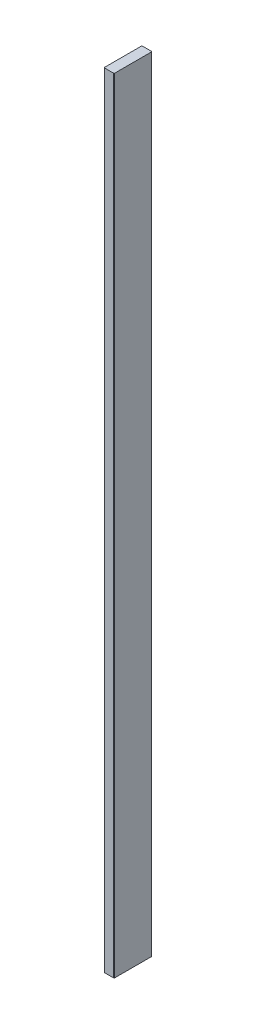
ISO-10303-21;
HEADER;
FILE_DESCRIPTION(('STEP AP214'),'2;1');
FILE_NAME('part.step','',(''),(''),'','','');
FILE_SCHEMA(('AUTOMOTIVE_DESIGN { 1 0 10303 214 1 1 1 1 }'));
ENDSEC;
DATA;
#1=APPLICATION_CONTEXT('core data for automotive mechanical design processes');
#2=APPLICATION_PROTOCOL_DEFINITION('international standard','automotive_design',2000,#1);
#3=PRODUCT_CONTEXT('',#1,'mechanical');
#4=PRODUCT('Part','Part','',(#3));
#5=PRODUCT_RELATED_PRODUCT_CATEGORY('part','',(#4));
#6=PRODUCT_DEFINITION_FORMATION('','',#4);
#7=PRODUCT_DEFINITION_CONTEXT('part definition',#1,'design');
#8=PRODUCT_DEFINITION('design','',#6,#7);
#9=PRODUCT_DEFINITION_SHAPE('','',#8);
#10=(LENGTH_UNIT() NAMED_UNIT(*) SI_UNIT(.MILLI.,.METRE.));
#11=(NAMED_UNIT(*) PLANE_ANGLE_UNIT() SI_UNIT($,.RADIAN.));
#12=(NAMED_UNIT(*) SI_UNIT($,.STERADIAN.) SOLID_ANGLE_UNIT());
#13=UNCERTAINTY_MEASURE_WITH_UNIT(LENGTH_MEASURE(1.E-05),#10,'distance_accuracy_value','');
#14=(GEOMETRIC_REPRESENTATION_CONTEXT(3) GLOBAL_UNCERTAINTY_ASSIGNED_CONTEXT((#13)) GLOBAL_UNIT_ASSIGNED_CONTEXT((#10,
#11,#12)) REPRESENTATION_CONTEXT('',''));
#15=CARTESIAN_POINT('',(0.,0.,0.));
#16=DIRECTION('',(0.,0.,1.));
#17=DIRECTION('',(1.,0.,0.));
#18=AXIS2_PLACEMENT_3D('',#15,#16,#17);
#19=CARTESIAN_POINT('',(16.,2482.,60.));
#20=DIRECTION('',(-1.,0.,0.));
#21=DIRECTION('',(0.,0.,1.));
#22=AXIS2_PLACEMENT_3D('',#19,#20,#21);
#23=PLANE('',#22);
#24=DIRECTION('',(0.,0.,-1.));
#25=VECTOR('',#24,1.);
#26=CARTESIAN_POINT('',(16.,0.,60.));
#27=LINE('',#26,#25);
#28=CARTESIAN_POINT('',(16.,0.,58.));
#29=VERTEX_POINT('',#28);
#30=CARTESIAN_POINT('',(16.,0.,-58.));
#31=VERTEX_POINT('',#30);
#32=EDGE_CURVE('E143',#29,#31,#27,.T.);
#33=ORIENTED_EDGE('',*,*,#32,.T.);
#34=DIRECTION('',(0.,-1.,0.));
#35=VECTOR('',#34,1.);
#36=CARTESIAN_POINT('',(16.,2482.,-58.));
#37=LINE('',#36,#35);
#38=CARTESIAN_POINT('',(16.,2482.,-58.));
#39=VERTEX_POINT('',#38);
#40=EDGE_CURVE('E176',#31,#39,#37,.F.);
#41=ORIENTED_EDGE('',*,*,#40,.T.);
#42=DIRECTION('',(0.,0.,-1.));
#43=VECTOR('',#42,1.);
#44=CARTESIAN_POINT('',(16.,2482.,60.));
#45=LINE('',#44,#43);
#46=CARTESIAN_POINT('',(16.,2482.,58.));
#47=VERTEX_POINT('',#46);
#48=EDGE_CURVE('E141',#47,#39,#45,.T.);
#49=ORIENTED_EDGE('',*,*,#48,.F.);
#50=DIRECTION('',(0.,-1.,0.));
#51=VECTOR('',#50,1.);
#52=CARTESIAN_POINT('',(16.,2482.,58.));
#53=LINE('',#52,#51);
#54=EDGE_CURVE('E172',#47,#29,#53,.T.);
#55=ORIENTED_EDGE('',*,*,#54,.T.);
#56=EDGE_LOOP('',(#33,#41,#49,#55));
#57=FACE_BOUND('',#56,.T.);
#58=ADVANCED_FACE('F39',(#57),#23,.F.);
#59=CARTESIAN_POINT('',(-16.,2482.,-60.));
#60=DIRECTION('',(0.,0.,1.));
#61=DIRECTION('',(1.,0.,0.));
#62=AXIS2_PLACEMENT_3D('',#59,#60,#61);
#63=PLANE('',#62);
#64=DIRECTION('',(-1.,0.,0.));
#65=VECTOR('',#64,1.);
#66=CARTESIAN_POINT('',(-16.,0.,-60.));
#67=LINE('',#66,#65);
#68=CARTESIAN_POINT('',(14.,0.,-60.));
#69=VERTEX_POINT('',#68);
#70=CARTESIAN_POINT('',(-14.,0.,-60.));
#71=VERTEX_POINT('',#70);
#72=EDGE_CURVE('E136',#69,#71,#67,.T.);
#73=ORIENTED_EDGE('',*,*,#72,.T.);
#74=DIRECTION('',(0.,-1.,0.));
#75=VECTOR('',#74,1.);
#76=CARTESIAN_POINT('',(-14.,2482.,-60.));
#77=LINE('',#76,#75);
#78=CARTESIAN_POINT('',(-14.,2482.,-60.));
#79=VERTEX_POINT('',#78);
#80=EDGE_CURVE('E111',#71,#79,#77,.F.);
#81=ORIENTED_EDGE('',*,*,#80,.T.);
#82=DIRECTION('',(-1.,0.,0.));
#83=VECTOR('',#82,1.);
#84=CARTESIAN_POINT('',(-16.,2482.,-60.));
#85=LINE('',#84,#83);
#86=CARTESIAN_POINT('',(14.,2482.,-60.));
#87=VERTEX_POINT('',#86);
#88=EDGE_CURVE('E201',#87,#79,#85,.T.);
#89=ORIENTED_EDGE('',*,*,#88,.F.);
#90=DIRECTION('',(0.,-1.,0.));
#91=VECTOR('',#90,1.);
#92=CARTESIAN_POINT('',(14.,2482.,-60.));
#93=LINE('',#92,#91);
#94=EDGE_CURVE('E117',#87,#69,#93,.T.);
#95=ORIENTED_EDGE('',*,*,#94,.T.);
#96=EDGE_LOOP('',(#73,#81,#89,#95));
#97=FACE_BOUND('',#96,.T.);
#98=ADVANCED_FACE('F248',(#97),#63,.F.);
#99=CARTESIAN_POINT('',(-16.,2482.,60.));
#100=DIRECTION('',(1.,0.,0.));
#101=DIRECTION('',(0.,0.,-1.));
#102=AXIS2_PLACEMENT_3D('',#99,#100,#101);
#103=PLANE('',#102);
#104=DIRECTION('',(0.,0.,1.));
#105=VECTOR('',#104,1.);
#106=CARTESIAN_POINT('',(-16.,2482.,60.));
#107=LINE('',#106,#105);
#108=CARTESIAN_POINT('',(-16.,2482.,-58.));
#109=VERTEX_POINT('',#108);
#110=CARTESIAN_POINT('',(-16.,2482.,58.));
#111=VERTEX_POINT('',#110);
#112=EDGE_CURVE('E126',#109,#111,#107,.T.);
#113=ORIENTED_EDGE('',*,*,#112,.F.);
#114=DIRECTION('',(0.,-1.,0.));
#115=VECTOR('',#114,1.);
#116=CARTESIAN_POINT('',(-16.,2482.,-58.));
#117=LINE('',#116,#115);
#118=CARTESIAN_POINT('',(-16.,0.,-58.));
#119=VERTEX_POINT('',#118);
#120=EDGE_CURVE('E110',#109,#119,#117,.T.);
#121=ORIENTED_EDGE('',*,*,#120,.T.);
#122=DIRECTION('',(0.,0.,1.));
#123=VECTOR('',#122,1.);
#124=CARTESIAN_POINT('',(-16.,0.,60.));
#125=LINE('',#124,#123);
#126=CARTESIAN_POINT('',(-16.,0.,58.));
#127=VERTEX_POINT('',#126);
#128=EDGE_CURVE('E124',#119,#127,#125,.T.);
#129=ORIENTED_EDGE('',*,*,#128,.T.);
#130=DIRECTION('',(0.,-1.,0.));
#131=VECTOR('',#130,1.);
#132=CARTESIAN_POINT('',(-16.,2482.,58.));
#133=LINE('',#132,#131);
#134=EDGE_CURVE('E129',#127,#111,#133,.F.);
#135=ORIENTED_EDGE('',*,*,#134,.T.);
#136=EDGE_LOOP('',(#113,#121,#129,#135));
#137=FACE_BOUND('',#136,.T.);
#138=ADVANCED_FACE('F123',(#137),#103,.F.);
#139=CARTESIAN_POINT('',(-16.,2482.,60.));
#140=DIRECTION('',(0.,0.,-1.));
#141=DIRECTION('',(-1.,0.,0.));
#142=AXIS2_PLACEMENT_3D('',#139,#140,#141);
#143=PLANE('',#142);
#144=DIRECTION('',(1.,0.,0.));
#145=VECTOR('',#144,1.);
#146=CARTESIAN_POINT('',(-16.,2482.,60.));
#147=LINE('',#146,#145);
#148=CARTESIAN_POINT('',(-14.,2482.,60.));
#149=VERTEX_POINT('',#148);
#150=CARTESIAN_POINT('',(14.,2482.,60.));
#151=VERTEX_POINT('',#150);
#152=EDGE_CURVE('E148',#149,#151,#147,.T.);
#153=ORIENTED_EDGE('',*,*,#152,.F.);
#154=DIRECTION('',(0.,-1.,0.));
#155=VECTOR('',#154,1.);
#156=CARTESIAN_POINT('',(-14.,2482.,60.));
#157=LINE('',#156,#155);
#158=CARTESIAN_POINT('',(-14.,0.,60.));
#159=VERTEX_POINT('',#158);
#160=EDGE_CURVE('E11',#149,#159,#157,.T.);
#161=ORIENTED_EDGE('',*,*,#160,.T.);
#162=DIRECTION('',(1.,0.,0.));
#163=VECTOR('',#162,1.);
#164=CARTESIAN_POINT('',(-16.,0.,60.));
#165=LINE('',#164,#163);
#166=CARTESIAN_POINT('',(14.,0.,60.));
#167=VERTEX_POINT('',#166);
#168=EDGE_CURVE('E135',#159,#167,#165,.T.);
#169=ORIENTED_EDGE('',*,*,#168,.T.);
#170=DIRECTION('',(0.,-1.,0.));
#171=VECTOR('',#170,1.);
#172=CARTESIAN_POINT('',(14.,2482.,60.));
#173=LINE('',#172,#171);
#174=EDGE_CURVE('E48',#167,#151,#173,.F.);
#175=ORIENTED_EDGE('',*,*,#174,.T.);
#176=EDGE_LOOP('',(#153,#161,#169,#175));
#177=FACE_BOUND('',#176,.T.);
#178=ADVANCED_FACE('F244',(#177),#143,.F.);
#179=CARTESIAN_POINT('',(0.,2482.,0.));
#180=DIRECTION('',(0.,-1.,0.));
#181=DIRECTION('',(0.,0.,-1.));
#182=AXIS2_PLACEMENT_3D('',#179,#180,#181);
#183=PLANE('',#182);
#184=ORIENTED_EDGE('',*,*,#88,.T.);
#185=CARTESIAN_POINT('',(-14.,2482.,-58.));
#186=DIRECTION('',(0.,-1.,0.));
#187=DIRECTION('',(0.,0.,-1.));
#188=AXIS2_PLACEMENT_3D('',#185,#186,#187);
#189=CIRCLE('',#188,2.);
#190=EDGE_CURVE('E169',#79,#109,#189,.F.);
#191=ORIENTED_EDGE('',*,*,#190,.T.);
#192=ORIENTED_EDGE('',*,*,#112,.T.);
#193=CARTESIAN_POINT('',(-14.,2482.,58.));
#194=DIRECTION('',(0.,-1.,0.));
#195=DIRECTION('',(0.,0.,-1.));
#196=AXIS2_PLACEMENT_3D('',#193,#194,#195);
#197=CIRCLE('',#196,2.);
#198=EDGE_CURVE('E61',#111,#149,#197,.F.);
#199=ORIENTED_EDGE('',*,*,#198,.T.);
#200=ORIENTED_EDGE('',*,*,#152,.T.);
#201=CARTESIAN_POINT('',(14.,2482.,58.));
#202=DIRECTION('',(0.,-1.,0.));
#203=DIRECTION('',(0.,0.,-1.));
#204=AXIS2_PLACEMENT_3D('',#201,#202,#203);
#205=CIRCLE('',#204,2.);
#206=EDGE_CURVE('E161',#151,#47,#205,.F.);
#207=ORIENTED_EDGE('',*,*,#206,.T.);
#208=ORIENTED_EDGE('',*,*,#48,.T.);
#209=CARTESIAN_POINT('',(14.,2482.,-58.));
#210=DIRECTION('',(0.,-1.,0.));
#211=DIRECTION('',(0.,0.,-1.));
#212=AXIS2_PLACEMENT_3D('',#209,#210,#211);
#213=CIRCLE('',#212,2.);
#214=EDGE_CURVE('E166',#39,#87,#213,.F.);
#215=ORIENTED_EDGE('',*,*,#214,.T.);
#216=EDGE_LOOP('',(#184,#191,#192,#199,#200,#207,#208,#215));
#217=FACE_BOUND('',#216,.T.);
#218=ADVANCED_FACE('F236',(#217),#183,.F.);
#219=CARTESIAN_POINT('',(0.,0.,0.));
#220=DIRECTION('',(0.,-1.,0.));
#221=DIRECTION('',(0.,0.,-1.));
#222=AXIS2_PLACEMENT_3D('',#219,#220,#221);
#223=PLANE('',#222);
#224=CARTESIAN_POINT('',(0.,0.,0.));
#225=DIRECTION('',(0.,-1.,0.));
#226=DIRECTION('',(0.,0.,-1.));
#227=AXIS2_PLACEMENT_3D('',#224,#225,#226);
#228=CIRCLE('',#227,6.);
#229=CARTESIAN_POINT('',(0.,0.,-6.));
#230=VERTEX_POINT('',#229);
#231=EDGE_CURVE('E214',#230,#230,#228,.T.);
#232=ORIENTED_EDGE('',*,*,#231,.F.);
#233=EDGE_LOOP('',(#232));
#234=FACE_BOUND('',#233,.T.);
#235=ORIENTED_EDGE('',*,*,#128,.F.);
#236=CARTESIAN_POINT('',(-14.,0.,-58.));
#237=DIRECTION('',(0.,-1.,0.));
#238=DIRECTION('',(0.,0.,-1.));
#239=AXIS2_PLACEMENT_3D('',#236,#237,#238);
#240=CIRCLE('',#239,2.);
#241=EDGE_CURVE('E106',#119,#71,#240,.T.);
#242=ORIENTED_EDGE('',*,*,#241,.T.);
#243=ORIENTED_EDGE('',*,*,#72,.F.);
#244=CARTESIAN_POINT('',(14.,0.,-58.));
#245=DIRECTION('',(0.,-1.,0.));
#246=DIRECTION('',(0.,0.,-1.));
#247=AXIS2_PLACEMENT_3D('',#244,#245,#246);
#248=CIRCLE('',#247,2.);
#249=EDGE_CURVE('E118',#69,#31,#248,.T.);
#250=ORIENTED_EDGE('',*,*,#249,.T.);
#251=ORIENTED_EDGE('',*,*,#32,.F.);
#252=CARTESIAN_POINT('',(14.,0.,58.));
#253=DIRECTION('',(0.,-1.,0.));
#254=DIRECTION('',(0.,0.,-1.));
#255=AXIS2_PLACEMENT_3D('',#252,#253,#254);
#256=CIRCLE('',#255,2.);
#257=EDGE_CURVE('E128',#29,#167,#256,.T.);
#258=ORIENTED_EDGE('',*,*,#257,.T.);
#259=ORIENTED_EDGE('',*,*,#168,.F.);
#260=CARTESIAN_POINT('',(-14.,0.,58.));
#261=DIRECTION('',(0.,-1.,0.));
#262=DIRECTION('',(0.,0.,-1.));
#263=AXIS2_PLACEMENT_3D('',#260,#261,#262);
#264=CIRCLE('',#263,2.);
#265=EDGE_CURVE('E133',#159,#127,#264,.T.);
#266=ORIENTED_EDGE('',*,*,#265,.T.);
#267=EDGE_LOOP('',(#235,#242,#243,#250,#251,#258,#259,#266));
#268=FACE_BOUND('',#267,.T.);
#269=ADVANCED_FACE('F131',(#234,#268),#223,.T.);
#270=CARTESIAN_POINT('',(-14.,2482.,-58.));
#271=DIRECTION('',(0.,-1.,0.));
#272=DIRECTION('',(0.,0.,-1.));
#273=AXIS2_PLACEMENT_3D('',#270,#271,#272);
#274=CYLINDRICAL_SURFACE('',#273,2.);
#275=ORIENTED_EDGE('',*,*,#190,.F.);
#276=ORIENTED_EDGE('',*,*,#80,.F.);
#277=ORIENTED_EDGE('',*,*,#241,.F.);
#278=ORIENTED_EDGE('',*,*,#120,.F.);
#279=EDGE_LOOP('',(#275,#276,#277,#278));
#280=FACE_BOUND('',#279,.T.);
#281=ADVANCED_FACE('F109',(#280),#274,.T.);
#282=CARTESIAN_POINT('',(14.,2482.,-58.));
#283=DIRECTION('',(0.,-1.,0.));
#284=DIRECTION('',(0.,0.,-1.));
#285=AXIS2_PLACEMENT_3D('',#282,#283,#284);
#286=CYLINDRICAL_SURFACE('',#285,2.);
#287=ORIENTED_EDGE('',*,*,#214,.F.);
#288=ORIENTED_EDGE('',*,*,#40,.F.);
#289=ORIENTED_EDGE('',*,*,#249,.F.);
#290=ORIENTED_EDGE('',*,*,#94,.F.);
#291=EDGE_LOOP('',(#287,#288,#289,#290));
#292=FACE_BOUND('',#291,.T.);
#293=ADVANCED_FACE('F242',(#292),#286,.T.);
#294=CARTESIAN_POINT('',(-14.,2482.,58.));
#295=DIRECTION('',(0.,-1.,0.));
#296=DIRECTION('',(0.,0.,-1.));
#297=AXIS2_PLACEMENT_3D('',#294,#295,#296);
#298=CYLINDRICAL_SURFACE('',#297,2.);
#299=ORIENTED_EDGE('',*,*,#198,.F.);
#300=ORIENTED_EDGE('',*,*,#134,.F.);
#301=ORIENTED_EDGE('',*,*,#265,.F.);
#302=ORIENTED_EDGE('',*,*,#160,.F.);
#303=EDGE_LOOP('',(#299,#300,#301,#302));
#304=FACE_BOUND('',#303,.T.);
#305=ADVANCED_FACE('F258',(#304),#298,.T.);
#306=CARTESIAN_POINT('',(14.,2482.,58.));
#307=DIRECTION('',(0.,-1.,0.));
#308=DIRECTION('',(0.,0.,-1.));
#309=AXIS2_PLACEMENT_3D('',#306,#307,#308);
#310=CYLINDRICAL_SURFACE('',#309,2.);
#311=ORIENTED_EDGE('',*,*,#206,.F.);
#312=ORIENTED_EDGE('',*,*,#174,.F.);
#313=ORIENTED_EDGE('',*,*,#257,.F.);
#314=ORIENTED_EDGE('',*,*,#54,.F.);
#315=EDGE_LOOP('',(#311,#312,#313,#314));
#316=FACE_BOUND('',#315,.T.);
#317=ADVANCED_FACE('F41',(#316),#310,.T.);
#318=CARTESIAN_POINT('',(0.,30.,0.));
#319=DIRECTION('',(0.,-1.,0.));
#320=DIRECTION('',(0.,0.,-1.));
#321=AXIS2_PLACEMENT_3D('',#318,#319,#320);
#322=CYLINDRICAL_SURFACE('',#321,6.);
#323=CARTESIAN_POINT('',(0.,30.,0.));
#324=DIRECTION('',(0.,-1.,0.));
#325=DIRECTION('',(0.,0.,-1.));
#326=AXIS2_PLACEMENT_3D('',#323,#324,#325);
#327=CIRCLE('',#326,6.);
#328=CARTESIAN_POINT('',(0.,30.,-6.));
#329=VERTEX_POINT('',#328);
#330=EDGE_CURVE('E218',#329,#329,#327,.T.);
#331=ORIENTED_EDGE('',*,*,#330,.F.);
#332=EDGE_LOOP('',(#331));
#333=FACE_BOUND('',#332,.T.);
#334=ORIENTED_EDGE('',*,*,#231,.T.);
#335=EDGE_LOOP('',(#334));
#336=FACE_BOUND('',#335,.T.);
#337=ADVANCED_FACE('F233',(#333,#336),#322,.F.);
#338=CARTESIAN_POINT('',(0.,30.,0.));
#339=DIRECTION('',(0.,-1.,0.));
#340=DIRECTION('',(0.,0.,-1.));
#341=AXIS2_PLACEMENT_3D('',#338,#339,#340);
#342=PLANE('',#341);
#343=ORIENTED_EDGE('',*,*,#330,.T.);
#344=EDGE_LOOP('',(#343));
#345=FACE_BOUND('',#344,.T.);
#346=ADVANCED_FACE('F341',(#345),#342,.T.);
#347=CLOSED_SHELL('',(#58,#98,#138,#178,#218,#269,#281,#293,#305,#317,#337,#346));
#348=MANIFOLD_SOLID_BREP('B2',#347);
#349=ADVANCED_BREP_SHAPE_REPRESENTATION('',(#18,#348),#14);
#350=SHAPE_DEFINITION_REPRESENTATION(#9,#349);
ENDSEC;
END-ISO-10303-21;
